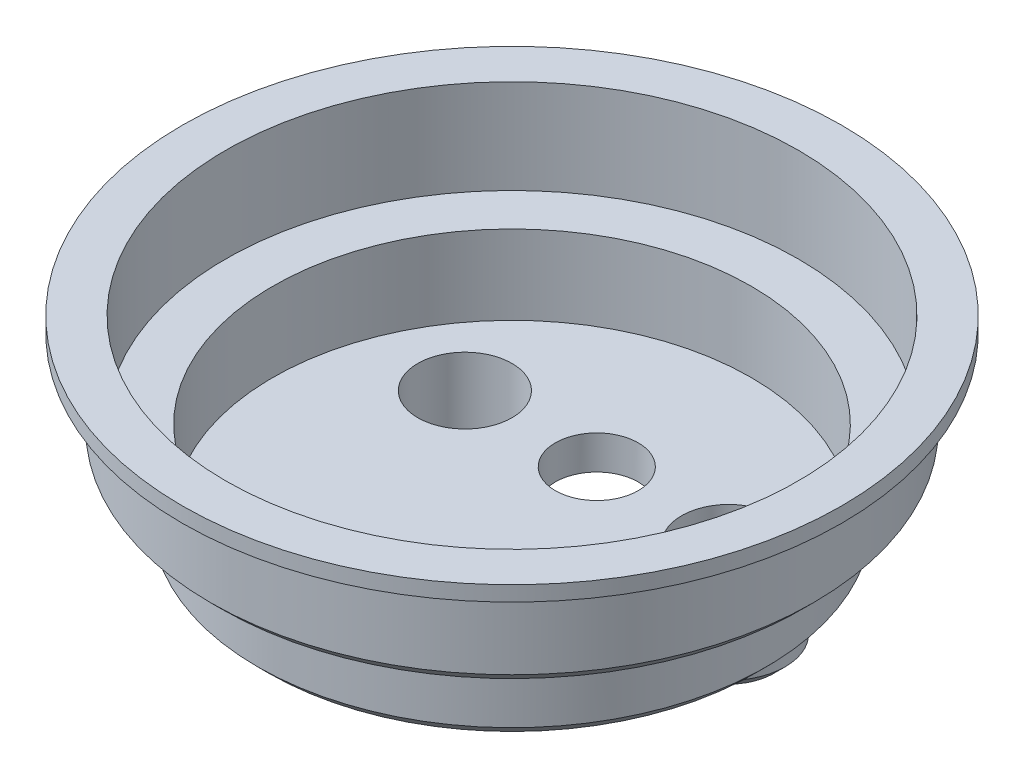
ISO-10303-21;
HEADER;
FILE_DESCRIPTION(('STEP AP214'),'2;1');
FILE_NAME('part.step','',(''),(''),'','','');
FILE_SCHEMA(('AUTOMOTIVE_DESIGN { 1 0 10303 214 1 1 1 1 }'));
ENDSEC;
DATA;
#1=APPLICATION_CONTEXT('core data for automotive mechanical design processes');
#2=APPLICATION_PROTOCOL_DEFINITION('international standard','automotive_design',2000,#1);
#3=PRODUCT_CONTEXT('',#1,'mechanical');
#4=PRODUCT('Part','Part','',(#3));
#5=PRODUCT_RELATED_PRODUCT_CATEGORY('part','',(#4));
#6=PRODUCT_DEFINITION_FORMATION('','',#4);
#7=PRODUCT_DEFINITION_CONTEXT('part definition',#1,'design');
#8=PRODUCT_DEFINITION('design','',#6,#7);
#9=PRODUCT_DEFINITION_SHAPE('','',#8);
#10=(LENGTH_UNIT() NAMED_UNIT(*) SI_UNIT(.MILLI.,.METRE.));
#11=(NAMED_UNIT(*) PLANE_ANGLE_UNIT() SI_UNIT($,.RADIAN.));
#12=(NAMED_UNIT(*) SI_UNIT($,.STERADIAN.) SOLID_ANGLE_UNIT());
#13=UNCERTAINTY_MEASURE_WITH_UNIT(LENGTH_MEASURE(1.E-05),#10,'distance_accuracy_value','');
#14=(GEOMETRIC_REPRESENTATION_CONTEXT(3) GLOBAL_UNCERTAINTY_ASSIGNED_CONTEXT((#13)) GLOBAL_UNIT_ASSIGNED_CONTEXT((#10,
#11,#12)) REPRESENTATION_CONTEXT('',''));
#15=CARTESIAN_POINT('',(0.,0.,0.));
#16=DIRECTION('',(0.,0.,1.));
#17=DIRECTION('',(1.,0.,0.));
#18=AXIS2_PLACEMENT_3D('',#15,#16,#17);
#19=CARTESIAN_POINT('',(0.,0.,0.));
#20=DIRECTION('',(0.,1.,0.));
#21=DIRECTION('',(0.,0.,1.));
#22=AXIS2_PLACEMENT_3D('',#19,#20,#21);
#23=PLANE('',#22);
#24=CARTESIAN_POINT('',(-35.,0.,-22.5));
#25=DIRECTION('',(0.,1.,0.));
#26=DIRECTION('',(0.,0.,1.));
#27=AXIS2_PLACEMENT_3D('',#24,#25,#26);
#28=CIRCLE('',#27,15.);
#29=CARTESIAN_POINT('',(-35.,0.,-7.5));
#30=VERTEX_POINT('',#29);
#31=EDGE_CURVE('E65',#30,#30,#28,.F.);
#32=ORIENTED_EDGE('',*,*,#31,.F.);
#33=EDGE_LOOP('',(#32));
#34=FACE_BOUND('',#33,.T.);
#35=CARTESIAN_POINT('',(35.,0.,-22.5));
#36=DIRECTION('',(0.,1.,0.));
#37=DIRECTION('',(0.,0.,1.));
#38=AXIS2_PLACEMENT_3D('',#35,#36,#37);
#39=CIRCLE('',#38,15.);
#40=CARTESIAN_POINT('',(35.,0.,-7.5));
#41=VERTEX_POINT('',#40);
#42=EDGE_CURVE('E78',#41,#41,#39,.F.);
#43=ORIENTED_EDGE('',*,*,#42,.F.);
#44=EDGE_LOOP('',(#43));
#45=FACE_BOUND('',#44,.T.);
#46=CARTESIAN_POINT('',(0.,0.,0.));
#47=DIRECTION('',(0.,1.,0.));
#48=DIRECTION('',(0.,0.,1.));
#49=AXIS2_PLACEMENT_3D('',#46,#47,#48);
#50=CIRCLE('',#49,64.4999999999999);
#51=CARTESIAN_POINT('',(0.,0.,64.4999999999999));
#52=VERTEX_POINT('',#51);
#53=EDGE_CURVE('E59',#52,#52,#50,.F.);
#54=ORIENTED_EDGE('',*,*,#53,.T.);
#55=EDGE_LOOP('',(#54));
#56=FACE_BOUND('',#55,.T.);
#57=CARTESIAN_POINT('',(0.,0.,-22.5));
#58=DIRECTION('',(0.,1.,0.));
#59=DIRECTION('',(0.,0.,1.));
#60=AXIS2_PLACEMENT_3D('',#57,#58,#59);
#61=CIRCLE('',#60,15.);
#62=CARTESIAN_POINT('',(0.,0.,-7.5));
#63=VERTEX_POINT('',#62);
#64=EDGE_CURVE('E10',#63,#63,#61,.F.);
#65=ORIENTED_EDGE('',*,*,#64,.F.);
#66=EDGE_LOOP('',(#65));
#67=FACE_BOUND('',#66,.T.);
#68=ADVANCED_FACE('F30',(#34,#45,#56,#67),#23,.F.);
#69=CARTESIAN_POINT('',(35.,-6.,-22.5));
#70=DIRECTION('',(0.,1.,0.));
#71=DIRECTION('',(0.,0.,1.));
#72=AXIS2_PLACEMENT_3D('',#69,#70,#71);
#73=CYLINDRICAL_SURFACE('',#72,6.25000000000001);
#74=CARTESIAN_POINT('',(35.,-20.,-22.5));
#75=DIRECTION('',(0.,-1.,0.));
#76=DIRECTION('',(0.,0.,-1.));
#77=AXIS2_PLACEMENT_3D('',#74,#75,#76);
#78=CIRCLE('',#77,6.25000000000001);
#79=CARTESIAN_POINT('',(35.,-20.,-28.75));
#80=VERTEX_POINT('',#79);
#81=EDGE_CURVE('E108',#80,#80,#78,.T.);
#82=ORIENTED_EDGE('',*,*,#81,.T.);
#83=EDGE_LOOP('',(#82));
#84=FACE_BOUND('',#83,.T.);
#85=CARTESIAN_POINT('',(35.,-16.,-22.5));
#86=DIRECTION('',(0.,1.,0.));
#87=DIRECTION('',(0.,0.,1.));
#88=AXIS2_PLACEMENT_3D('',#85,#86,#87);
#89=CIRCLE('',#88,6.25000000000001);
#90=CARTESIAN_POINT('',(35.,-16.,-16.25));
#91=VERTEX_POINT('',#90);
#92=EDGE_CURVE('E66',#91,#91,#89,.F.);
#93=ORIENTED_EDGE('',*,*,#92,.F.);
#94=EDGE_LOOP('',(#93));
#95=FACE_BOUND('',#94,.T.);
#96=ADVANCED_FACE('F145',(#84,#95),#73,.F.);
#97=CARTESIAN_POINT('',(-35.,-6.,-22.5));
#98=DIRECTION('',(0.,1.,0.));
#99=DIRECTION('',(0.,0.,1.));
#100=AXIS2_PLACEMENT_3D('',#97,#98,#99);
#101=CYLINDRICAL_SURFACE('',#100,6.25);
#102=CARTESIAN_POINT('',(-35.,-20.,-22.5));
#103=DIRECTION('',(0.,-1.,0.));
#104=DIRECTION('',(0.,0.,-1.));
#105=AXIS2_PLACEMENT_3D('',#102,#103,#104);
#106=CIRCLE('',#105,6.25);
#107=CARTESIAN_POINT('',(-35.,-20.,-28.75));
#108=VERTEX_POINT('',#107);
#109=EDGE_CURVE('E74',#108,#108,#106,.T.);
#110=ORIENTED_EDGE('',*,*,#109,.T.);
#111=EDGE_LOOP('',(#110));
#112=FACE_BOUND('',#111,.T.);
#113=CARTESIAN_POINT('',(-35.,-16.,-22.5));
#114=DIRECTION('',(0.,1.,0.));
#115=DIRECTION('',(0.,0.,1.));
#116=AXIS2_PLACEMENT_3D('',#113,#114,#115);
#117=CIRCLE('',#116,6.25);
#118=CARTESIAN_POINT('',(-35.,-16.,-16.25));
#119=VERTEX_POINT('',#118);
#120=EDGE_CURVE('E71',#119,#119,#117,.F.);
#121=ORIENTED_EDGE('',*,*,#120,.F.);
#122=EDGE_LOOP('',(#121));
#123=FACE_BOUND('',#122,.T.);
#124=ADVANCED_FACE('F151',(#112,#123),#101,.F.);
#125=CARTESIAN_POINT('',(0.,21.,0.));
#126=DIRECTION('',(0.,-1.,0.));
#127=DIRECTION('',(0.,0.,-1.));
#128=AXIS2_PLACEMENT_3D('',#125,#126,#127);
#129=CYLINDRICAL_SURFACE('',#128,67.5);
#130=CARTESIAN_POINT('',(0.,3.00000000000009,0.));
#131=DIRECTION('',(0.,1.,0.));
#132=DIRECTION('',(0.,0.,1.));
#133=AXIS2_PLACEMENT_3D('',#130,#131,#132);
#134=CIRCLE('',#133,67.5);
#135=CARTESIAN_POINT('',(0.,3.00000000000009,-67.5));
#136=VERTEX_POINT('',#135);
#137=EDGE_CURVE('E62',#136,#136,#134,.T.);
#138=CARTESIAN_POINT('',(0.,21.,0.));
#139=DIRECTION('',(0.,1.,0.));
#140=DIRECTION('',(0.,0.,1.));
#141=AXIS2_PLACEMENT_3D('',#138,#139,#140);
#142=CIRCLE('',#141,67.5);
#143=CARTESIAN_POINT('',(0.,21.,-67.5));
#144=VERTEX_POINT('',#143);
#145=EDGE_CURVE('E81',#144,#144,#142,.T.);
#146=CARTESIAN_POINT('',(0.,3.00000000000009,-67.5));
#147=CARTESIAN_POINT('',(0.,3.18750000000008,-67.5));
#148=CARTESIAN_POINT('',(0.,3.37500000000008,-67.5));
#149=CARTESIAN_POINT('',(0.,3.75000000000008,-67.5));
#150=CARTESIAN_POINT('',(0.,3.93750000000008,-67.5));
#151=CARTESIAN_POINT('',(0.,4.31250000000008,-67.5));
#152=CARTESIAN_POINT('',(0.,4.50000000000008,-67.5));
#153=CARTESIAN_POINT('',(0.,4.87500000000008,-67.5));
#154=CARTESIAN_POINT('',(0.,5.06250000000007,-67.5));
#155=CARTESIAN_POINT('',(0.,5.43750000000007,-67.5));
#156=CARTESIAN_POINT('',(0.,5.62500000000007,-67.5));
#157=CARTESIAN_POINT('',(0.,6.00000000000007,-67.5));
#158=CARTESIAN_POINT('',(0.,6.18750000000007,-67.5));
#159=CARTESIAN_POINT('',(0.,6.56250000000007,-67.5));
#160=CARTESIAN_POINT('',(0.,6.75000000000007,-67.5));
#161=CARTESIAN_POINT('',(0.,7.12500000000007,-67.5));
#162=CARTESIAN_POINT('',(0.,7.31250000000006,-67.5));
#163=CARTESIAN_POINT('',(0.,7.68750000000006,-67.5));
#164=CARTESIAN_POINT('',(0.,7.87500000000006,-67.5));
#165=CARTESIAN_POINT('',(0.,8.25000000000006,-67.5));
#166=CARTESIAN_POINT('',(0.,8.43750000000006,-67.5));
#167=CARTESIAN_POINT('',(0.,8.81250000000006,-67.5));
#168=CARTESIAN_POINT('',(0.,9.00000000000006,-67.5));
#169=CARTESIAN_POINT('',(0.,9.37500000000006,-67.5));
#170=CARTESIAN_POINT('',(0.,9.56250000000006,-67.5));
#171=CARTESIAN_POINT('',(0.,9.93750000000005,-67.5));
#172=CARTESIAN_POINT('',(0.,10.1250000000001,-67.5));
#173=CARTESIAN_POINT('',(0.,10.5000000000001,-67.5));
#174=CARTESIAN_POINT('',(0.,10.6875,-67.5));
#175=CARTESIAN_POINT('',(0.,11.0625,-67.5));
#176=CARTESIAN_POINT('',(0.,11.25,-67.5));
#177=CARTESIAN_POINT('',(0.,11.625,-67.5));
#178=CARTESIAN_POINT('',(0.,11.8125,-67.5));
#179=CARTESIAN_POINT('',(0.,12.1875,-67.5));
#180=CARTESIAN_POINT('',(0.,12.375,-67.5));
#181=CARTESIAN_POINT('',(0.,12.75,-67.5));
#182=CARTESIAN_POINT('',(0.,12.9375,-67.5));
#183=CARTESIAN_POINT('',(0.,13.3125,-67.5));
#184=CARTESIAN_POINT('',(0.,13.5,-67.5));
#185=CARTESIAN_POINT('',(0.,13.875,-67.5));
#186=CARTESIAN_POINT('',(0.,14.0625,-67.5));
#187=CARTESIAN_POINT('',(0.,14.4375,-67.5));
#188=CARTESIAN_POINT('',(0.,14.625,-67.5));
#189=CARTESIAN_POINT('',(0.,15.,-67.5));
#190=CARTESIAN_POINT('',(0.,15.1875,-67.5));
#191=CARTESIAN_POINT('',(0.,15.5625,-67.5));
#192=CARTESIAN_POINT('',(0.,15.75,-67.5));
#193=CARTESIAN_POINT('',(0.,16.125,-67.5));
#194=CARTESIAN_POINT('',(0.,16.3125,-67.5));
#195=CARTESIAN_POINT('',(0.,16.6875,-67.5));
#196=CARTESIAN_POINT('',(0.,16.875,-67.5));
#197=CARTESIAN_POINT('',(0.,17.25,-67.5));
#198=CARTESIAN_POINT('',(0.,17.4375,-67.5));
#199=CARTESIAN_POINT('',(0.,17.8125,-67.5));
#200=CARTESIAN_POINT('',(0.,18.,-67.5));
#201=CARTESIAN_POINT('',(0.,18.375,-67.5));
#202=CARTESIAN_POINT('',(0.,18.5625,-67.5));
#203=CARTESIAN_POINT('',(0.,18.9375,-67.5));
#204=CARTESIAN_POINT('',(0.,19.125,-67.5));
#205=CARTESIAN_POINT('',(0.,19.5,-67.5));
#206=CARTESIAN_POINT('',(0.,19.6875,-67.5));
#207=CARTESIAN_POINT('',(0.,20.0625,-67.5));
#208=CARTESIAN_POINT('',(0.,20.25,-67.5));
#209=CARTESIAN_POINT('',(0.,20.625,-67.5));
#210=CARTESIAN_POINT('',(0.,20.8125,-67.5));
#211=CARTESIAN_POINT('',(0.,21.,-67.5));
#212=B_SPLINE_CURVE_WITH_KNOTS('',3,(#146,#147,#148,#149,#150,#151,#152,#153,#154,#155,#156,
#157,#158,#159,#160,#161,#162,#163,#164,#165,#166,#167,#168,#169,#170,#171,#172,#173,#174,#175,
#176,#177,#178,#179,#180,#181,#182,#183,#184,#185,#186,#187,#188,#189,#190,#191,#192,#193,#194,
#195,#196,#197,#198,#199,#200,#201,#202,#203,#204,#205,#206,#207,#208,#209,#210,#211),
.UNSPECIFIED.,.F.,.F.,(4,2,2,2,2,2,2,2,2,2,2,2,2,2,2,2,2,2,2,2,2,2,2,2,2,2,2,2,2,2,2,2,4),(0.,
0.562499999999997,1.12499999999999,1.68749999999999,2.24999999999999,2.81249999999999,
3.37499999999998,3.93749999999998,4.49999999999998,5.06249999999998,5.62499999999997,
6.18749999999997,6.74999999999997,7.31249999999996,7.87499999999996,8.43749999999996,
8.99999999999996,9.56249999999996,10.125,10.6875,11.2499999999999,11.8124999999999,
12.3749999999999,12.9374999999999,13.4999999999999,14.0624999999999,14.6249999999999,
15.1874999999999,15.7499999999999,16.3124999999999,16.8749999999999,17.4374999999999,
17.9999999999999),.UNSPECIFIED.);
#213=EDGE_CURVE('BSEAM160',#136,#144,#212,.T.);
#214=ORIENTED_EDGE('',*,*,#137,.T.);
#215=ORIENTED_EDGE('',*,*,#145,.F.);
#216=ORIENTED_EDGE('',*,*,#213,.T.);
#217=ORIENTED_EDGE('',*,*,#213,.F.);
#218=EDGE_LOOP('',(#214,#216,#215,#217));
#219=FACE_BOUND('',#218,.T.);
#220=ADVANCED_FACE('F160',(#219),#129,.T.);
#221=CARTESIAN_POINT('',(0.,21.,0.));
#222=DIRECTION('',(0.,1.,0.));
#223=DIRECTION('',(0.,0.,1.));
#224=AXIS2_PLACEMENT_3D('',#221,#222,#223);
#225=PLANE('',#224);
#226=CARTESIAN_POINT('',(0.,21.,0.));
#227=DIRECTION('',(0.,1.,0.));
#228=DIRECTION('',(0.,0.,1.));
#229=AXIS2_PLACEMENT_3D('',#226,#227,#228);
#230=CIRCLE('',#229,77.);
#231=CARTESIAN_POINT('',(0.,21.,77.));
#232=VERTEX_POINT('',#231);
#233=EDGE_CURVE('E53',#232,#232,#230,.F.);
#234=ORIENTED_EDGE('',*,*,#233,.T.);
#235=EDGE_LOOP('',(#234));
#236=FACE_BOUND('',#235,.T.);
#237=ORIENTED_EDGE('',*,*,#145,.T.);
#238=EDGE_LOOP('',(#237));
#239=FACE_BOUND('',#238,.T.);
#240=ADVANCED_FACE('F163',(#236,#239),#225,.F.);
#241=CARTESIAN_POINT('',(0.,46.,0.));
#242=DIRECTION('',(0.,-1.,0.));
#243=DIRECTION('',(0.,0.,-1.));
#244=AXIS2_PLACEMENT_3D('',#241,#242,#243);
#245=CYLINDRICAL_SURFACE('',#244,80.);
#246=CARTESIAN_POINT('',(0.,24.,0.));
#247=DIRECTION('',(0.,1.,0.));
#248=DIRECTION('',(0.,0.,1.));
#249=AXIS2_PLACEMENT_3D('',#246,#247,#248);
#250=CIRCLE('',#249,80.);
#251=CARTESIAN_POINT('',(0.,24.,80.));
#252=VERTEX_POINT('',#251);
#253=EDGE_CURVE('E56',#252,#252,#250,.T.);
#254=ORIENTED_EDGE('',*,*,#253,.T.);
#255=EDGE_LOOP('',(#254));
#256=FACE_BOUND('',#255,.T.);
#257=CARTESIAN_POINT('',(0.,46.,0.));
#258=DIRECTION('',(0.,1.,0.));
#259=DIRECTION('',(0.,0.,1.));
#260=AXIS2_PLACEMENT_3D('',#257,#258,#259);
#261=CIRCLE('',#260,80.);
#262=CARTESIAN_POINT('',(0.,46.,80.));
#263=VERTEX_POINT('',#262);
#264=EDGE_CURVE('E84',#263,#263,#261,.T.);
#265=ORIENTED_EDGE('',*,*,#264,.F.);
#266=EDGE_LOOP('',(#265));
#267=FACE_BOUND('',#266,.T.);
#268=ADVANCED_FACE('F158',(#256,#267),#245,.T.);
#269=CARTESIAN_POINT('',(0.,46.,0.));
#270=DIRECTION('',(0.,1.,0.));
#271=DIRECTION('',(0.,0.,1.));
#272=AXIS2_PLACEMENT_3D('',#269,#270,#271);
#273=PLANE('',#272);
#274=CARTESIAN_POINT('',(0.,46.,0.));
#275=DIRECTION('',(0.,1.,0.));
#276=DIRECTION('',(0.,0.,1.));
#277=AXIS2_PLACEMENT_3D('',#274,#275,#276);
#278=CIRCLE('',#277,87.5);
#279=CARTESIAN_POINT('',(0.,46.,87.5));
#280=VERTEX_POINT('',#279);
#281=EDGE_CURVE('E88',#280,#280,#278,.T.);
#282=ORIENTED_EDGE('',*,*,#281,.F.);
#283=EDGE_LOOP('',(#282));
#284=FACE_BOUND('',#283,.T.);
#285=ORIENTED_EDGE('',*,*,#264,.T.);
#286=EDGE_LOOP('',(#285));
#287=FACE_BOUND('',#286,.T.);
#288=ADVANCED_FACE('F241',(#284,#287),#273,.F.);
#289=CARTESIAN_POINT('',(0.,50.,0.));
#290=DIRECTION('',(0.,-1.,0.));
#291=DIRECTION('',(0.,0.,-1.));
#292=AXIS2_PLACEMENT_3D('',#289,#290,#291);
#293=CYLINDRICAL_SURFACE('',#292,87.5);
#294=CARTESIAN_POINT('',(0.,50.,0.));
#295=DIRECTION('',(0.,1.,0.));
#296=DIRECTION('',(0.,0.,1.));
#297=AXIS2_PLACEMENT_3D('',#294,#295,#296);
#298=CIRCLE('',#297,87.5);
#299=CARTESIAN_POINT('',(0.,50.,87.5));
#300=VERTEX_POINT('',#299);
#301=EDGE_CURVE('E87',#300,#300,#298,.T.);
#302=ORIENTED_EDGE('',*,*,#301,.F.);
#303=EDGE_LOOP('',(#302));
#304=FACE_BOUND('',#303,.T.);
#305=ORIENTED_EDGE('',*,*,#281,.T.);
#306=EDGE_LOOP('',(#305));
#307=FACE_BOUND('',#306,.T.);
#308=ADVANCED_FACE('F239',(#304,#307),#293,.T.);
#309=CARTESIAN_POINT('',(0.,50.,0.));
#310=DIRECTION('',(0.,1.,0.));
#311=DIRECTION('',(0.,0.,1.));
#312=AXIS2_PLACEMENT_3D('',#309,#310,#311);
#313=PLANE('',#312);
#314=CARTESIAN_POINT('',(0.,50.,0.));
#315=DIRECTION('',(0.,1.,0.));
#316=DIRECTION('',(0.,0.,1.));
#317=AXIS2_PLACEMENT_3D('',#314,#315,#316);
#318=CIRCLE('',#317,76.);
#319=CARTESIAN_POINT('',(0.,50.,76.));
#320=VERTEX_POINT('',#319);
#321=EDGE_CURVE('E94',#320,#320,#318,.T.);
#322=ORIENTED_EDGE('',*,*,#321,.F.);
#323=EDGE_LOOP('',(#322));
#324=FACE_BOUND('',#323,.T.);
#325=ORIENTED_EDGE('',*,*,#301,.T.);
#326=EDGE_LOOP('',(#325));
#327=FACE_BOUND('',#326,.T.);
#328=ADVANCED_FACE('F225',(#324,#327),#313,.T.);
#329=CARTESIAN_POINT('',(0.,21.,0.));
#330=DIRECTION('',(0.,-1.,0.));
#331=DIRECTION('',(0.,0.,-1.));
#332=AXIS2_PLACEMENT_3D('',#329,#330,#331);
#333=CYLINDRICAL_SURFACE('',#332,63.5);
#334=CARTESIAN_POINT('',(0.,25.,0.));
#335=DIRECTION('',(0.,1.,0.));
#336=DIRECTION('',(0.,0.,1.));
#337=AXIS2_PLACEMENT_3D('',#334,#335,#336);
#338=CIRCLE('',#337,63.5);
#339=CARTESIAN_POINT('',(0.,25.,-63.5));
#340=VERTEX_POINT('',#339);
#341=EDGE_CURVE('E91',#340,#340,#338,.T.);
#342=CARTESIAN_POINT('',(0.,4.,0.));
#343=DIRECTION('',(0.,1.,0.));
#344=DIRECTION('',(0.,0.,1.));
#345=AXIS2_PLACEMENT_3D('',#342,#343,#344);
#346=CIRCLE('',#345,63.5);
#347=CARTESIAN_POINT('',(0.,4.,-63.5));
#348=VERTEX_POINT('',#347);
#349=EDGE_CURVE('E97',#348,#348,#346,.T.);
#350=CARTESIAN_POINT('',(0.,25.,-63.5));
#351=CARTESIAN_POINT('',(0.,24.78125,-63.5));
#352=CARTESIAN_POINT('',(0.,24.5625,-63.5));
#353=CARTESIAN_POINT('',(0.,24.125,-63.5));
#354=CARTESIAN_POINT('',(0.,23.90625,-63.5));
#355=CARTESIAN_POINT('',(0.,23.46875,-63.5));
#356=CARTESIAN_POINT('',(0.,23.25,-63.5));
#357=CARTESIAN_POINT('',(0.,22.8125,-63.5));
#358=CARTESIAN_POINT('',(0.,22.59375,-63.5));
#359=CARTESIAN_POINT('',(0.,22.15625,-63.5));
#360=CARTESIAN_POINT('',(0.,21.9375,-63.5));
#361=CARTESIAN_POINT('',(0.,21.5,-63.5));
#362=CARTESIAN_POINT('',(0.,21.28125,-63.5));
#363=CARTESIAN_POINT('',(0.,20.84375,-63.5));
#364=CARTESIAN_POINT('',(0.,20.625,-63.5));
#365=CARTESIAN_POINT('',(0.,20.1875,-63.5));
#366=CARTESIAN_POINT('',(0.,19.96875,-63.5));
#367=CARTESIAN_POINT('',(0.,19.53125,-63.5));
#368=CARTESIAN_POINT('',(0.,19.3125,-63.5));
#369=CARTESIAN_POINT('',(0.,18.875,-63.5));
#370=CARTESIAN_POINT('',(0.,18.65625,-63.5));
#371=CARTESIAN_POINT('',(0.,18.21875,-63.5));
#372=CARTESIAN_POINT('',(0.,18.,-63.5));
#373=CARTESIAN_POINT('',(0.,17.5625,-63.5));
#374=CARTESIAN_POINT('',(0.,17.34375,-63.5));
#375=CARTESIAN_POINT('',(0.,16.90625,-63.5));
#376=CARTESIAN_POINT('',(0.,16.6875,-63.5));
#377=CARTESIAN_POINT('',(0.,16.25,-63.5));
#378=CARTESIAN_POINT('',(0.,16.03125,-63.5));
#379=CARTESIAN_POINT('',(0.,15.59375,-63.5));
#380=CARTESIAN_POINT('',(0.,15.375,-63.5));
#381=CARTESIAN_POINT('',(0.,14.9375,-63.5));
#382=CARTESIAN_POINT('',(0.,14.71875,-63.5));
#383=CARTESIAN_POINT('',(0.,14.28125,-63.5));
#384=CARTESIAN_POINT('',(0.,14.0625,-63.5));
#385=CARTESIAN_POINT('',(0.,13.625,-63.5));
#386=CARTESIAN_POINT('',(0.,13.40625,-63.5));
#387=CARTESIAN_POINT('',(0.,12.96875,-63.5));
#388=CARTESIAN_POINT('',(0.,12.75,-63.5));
#389=CARTESIAN_POINT('',(0.,12.3125,-63.5));
#390=CARTESIAN_POINT('',(0.,12.09375,-63.5));
#391=CARTESIAN_POINT('',(0.,11.65625,-63.5));
#392=CARTESIAN_POINT('',(0.,11.4375,-63.5));
#393=CARTESIAN_POINT('',(0.,11.,-63.5));
#394=CARTESIAN_POINT('',(0.,10.78125,-63.5));
#395=CARTESIAN_POINT('',(0.,10.34375,-63.5));
#396=CARTESIAN_POINT('',(0.,10.125,-63.5));
#397=CARTESIAN_POINT('',(0.,9.6875,-63.5));
#398=CARTESIAN_POINT('',(0.,9.46875,-63.5));
#399=CARTESIAN_POINT('',(0.,9.03125,-63.5));
#400=CARTESIAN_POINT('',(0.,8.8125,-63.5));
#401=CARTESIAN_POINT('',(0.,8.375,-63.5));
#402=CARTESIAN_POINT('',(0.,8.15625,-63.5));
#403=CARTESIAN_POINT('',(0.,7.71875,-63.5));
#404=CARTESIAN_POINT('',(0.,7.5,-63.5));
#405=CARTESIAN_POINT('',(0.,7.0625,-63.5));
#406=CARTESIAN_POINT('',(0.,6.84375,-63.5));
#407=CARTESIAN_POINT('',(0.,6.40625,-63.5));
#408=CARTESIAN_POINT('',(0.,6.1875,-63.5));
#409=CARTESIAN_POINT('',(0.,5.75,-63.5));
#410=CARTESIAN_POINT('',(0.,5.53125,-63.5));
#411=CARTESIAN_POINT('',(0.,5.09375,-63.5));
#412=CARTESIAN_POINT('',(0.,4.875,-63.5));
#413=CARTESIAN_POINT('',(0.,4.4375,-63.5));
#414=CARTESIAN_POINT('',(0.,4.21875,-63.5));
#415=CARTESIAN_POINT('',(0.,4.,-63.5));
#416=B_SPLINE_CURVE_WITH_KNOTS('',3,(#350,#351,#352,#353,#354,#355,#356,#357,#358,#359,#360,
#361,#362,#363,#364,#365,#366,#367,#368,#369,#370,#371,#372,#373,#374,#375,#376,#377,#378,#379,
#380,#381,#382,#383,#384,#385,#386,#387,#388,#389,#390,#391,#392,#393,#394,#395,#396,#397,#398,
#399,#400,#401,#402,#403,#404,#405,#406,#407,#408,#409,#410,#411,#412,#413,#414,#415),
.UNSPECIFIED.,.F.,.F.,(4,2,2,2,2,2,2,2,2,2,2,2,2,2,2,2,2,2,2,2,2,2,2,2,2,2,2,2,2,2,2,2,4),(0.,
0.656250000000001,1.3125,1.96875,2.625,3.28125,3.9375,4.59375,5.25,5.90625,6.5625,7.21875,7.875,
8.53125,9.1875,9.84375,10.5,11.15625,11.8125,12.46875,13.125,13.78125,14.4375,15.09375,15.75,
16.40625,17.0625,17.71875,18.375,19.03125,19.6875,20.34375,21.),.UNSPECIFIED.);
#417=EDGE_CURVE('BSEAM221',#340,#348,#416,.T.);
#418=ORIENTED_EDGE('',*,*,#341,.T.);
#419=ORIENTED_EDGE('',*,*,#349,.F.);
#420=ORIENTED_EDGE('',*,*,#417,.T.);
#421=ORIENTED_EDGE('',*,*,#417,.F.);
#422=EDGE_LOOP('',(#418,#420,#419,#421));
#423=FACE_BOUND('',#422,.T.);
#424=ADVANCED_FACE('F221',(#423),#333,.F.);
#425=CARTESIAN_POINT('',(0.,4.,0.));
#426=DIRECTION('',(0.,1.,0.));
#427=DIRECTION('',(0.,0.,1.));
#428=AXIS2_PLACEMENT_3D('',#425,#426,#427);
#429=PLANE('',#428);
#430=CARTESIAN_POINT('',(35.,4.,-22.5));
#431=DIRECTION('',(0.,1.,0.));
#432=DIRECTION('',(0.,0.,1.));
#433=AXIS2_PLACEMENT_3D('',#430,#431,#432);
#434=CIRCLE('',#433,12.5);
#435=CARTESIAN_POINT('',(35.,4.,-10.));
#436=VERTEX_POINT('',#435);
#437=EDGE_CURVE('E117',#436,#436,#434,.T.);
#438=ORIENTED_EDGE('',*,*,#437,.F.);
#439=EDGE_LOOP('',(#438));
#440=FACE_BOUND('',#439,.T.);
#441=CARTESIAN_POINT('',(-35.,4.,-22.5));
#442=DIRECTION('',(0.,1.,0.));
#443=DIRECTION('',(0.,0.,1.));
#444=AXIS2_PLACEMENT_3D('',#441,#442,#443);
#445=CIRCLE('',#444,12.5);
#446=CARTESIAN_POINT('',(-35.,4.,-9.99999999999999));
#447=VERTEX_POINT('',#446);
#448=EDGE_CURVE('E69',#447,#447,#445,.T.);
#449=ORIENTED_EDGE('',*,*,#448,.F.);
#450=EDGE_LOOP('',(#449));
#451=FACE_BOUND('',#450,.T.);
#452=CARTESIAN_POINT('',(0.,4.,-22.5));
#453=DIRECTION('',(0.,1.,0.));
#454=DIRECTION('',(0.,0.,1.));
#455=AXIS2_PLACEMENT_3D('',#452,#453,#454);
#456=CIRCLE('',#455,11.);
#457=CARTESIAN_POINT('',(0.,4.,-11.5));
#458=VERTEX_POINT('',#457);
#459=EDGE_CURVE('E101',#458,#458,#456,.T.);
#460=ORIENTED_EDGE('',*,*,#459,.F.);
#461=EDGE_LOOP('',(#460));
#462=FACE_BOUND('',#461,.T.);
#463=ORIENTED_EDGE('',*,*,#349,.T.);
#464=EDGE_LOOP('',(#463));
#465=FACE_BOUND('',#464,.T.);
#466=ADVANCED_FACE('F224',(#440,#451,#462,#465),#429,.T.);
#467=CARTESIAN_POINT('',(0.,25.,0.));
#468=DIRECTION('',(0.,1.,0.));
#469=DIRECTION('',(0.,0.,1.));
#470=AXIS2_PLACEMENT_3D('',#467,#468,#469);
#471=PLANE('',#470);
#472=CARTESIAN_POINT('',(0.,25.,0.));
#473=DIRECTION('',(0.,1.,0.));
#474=DIRECTION('',(0.,0.,1.));
#475=AXIS2_PLACEMENT_3D('',#472,#473,#474);
#476=CIRCLE('',#475,76.);
#477=CARTESIAN_POINT('',(0.,25.,76.));
#478=VERTEX_POINT('',#477);
#479=EDGE_CURVE('E98',#478,#478,#476,.T.);
#480=ORIENTED_EDGE('',*,*,#479,.T.);
#481=EDGE_LOOP('',(#480));
#482=FACE_BOUND('',#481,.T.);
#483=ORIENTED_EDGE('',*,*,#341,.F.);
#484=EDGE_LOOP('',(#483));
#485=FACE_BOUND('',#484,.T.);
#486=ADVANCED_FACE('F229',(#482,#485),#471,.T.);
#487=CARTESIAN_POINT('',(0.,46.,0.));
#488=DIRECTION('',(0.,-1.,0.));
#489=DIRECTION('',(0.,0.,-1.));
#490=AXIS2_PLACEMENT_3D('',#487,#488,#489);
#491=CYLINDRICAL_SURFACE('',#490,76.);
#492=ORIENTED_EDGE('',*,*,#321,.T.);
#493=EDGE_LOOP('',(#492));
#494=FACE_BOUND('',#493,.T.);
#495=ORIENTED_EDGE('',*,*,#479,.F.);
#496=EDGE_LOOP('',(#495));
#497=FACE_BOUND('',#496,.T.);
#498=ADVANCED_FACE('F219',(#494,#497),#491,.F.);
#499=CARTESIAN_POINT('',(0.,-6.,-22.5));
#500=DIRECTION('',(0.,1.,0.));
#501=DIRECTION('',(0.,0.,1.));
#502=AXIS2_PLACEMENT_3D('',#499,#500,#501);
#503=CYLINDRICAL_SURFACE('',#502,11.);
#504=ORIENTED_EDGE('',*,*,#459,.T.);
#505=EDGE_LOOP('',(#504));
#506=FACE_BOUND('',#505,.T.);
#507=CARTESIAN_POINT('',(0.,-5.,-22.5));
#508=DIRECTION('',(0.,-1.,0.));
#509=DIRECTION('',(0.,0.,-1.));
#510=AXIS2_PLACEMENT_3D('',#507,#508,#509);
#511=CIRCLE('',#510,11.);
#512=CARTESIAN_POINT('',(0.,-5.,-33.5));
#513=VERTEX_POINT('',#512);
#514=EDGE_CURVE('E125',#513,#513,#511,.T.);
#515=ORIENTED_EDGE('',*,*,#514,.T.);
#516=EDGE_LOOP('',(#515));
#517=FACE_BOUND('',#516,.T.);
#518=ADVANCED_FACE('F129',(#506,#517),#503,.F.);
#519=CARTESIAN_POINT('',(35.,-20.,-22.5));
#520=DIRECTION('',(0.,-1.,0.));
#521=DIRECTION('',(0.,0.,-1.));
#522=AXIS2_PLACEMENT_3D('',#519,#520,#521);
#523=PLANE('',#522);
#524=CARTESIAN_POINT('',(35.,-20.,-22.5));
#525=DIRECTION('',(0.,-1.,0.));
#526=DIRECTION('',(0.,0.,-1.));
#527=AXIS2_PLACEMENT_3D('',#524,#525,#526);
#528=CIRCLE('',#527,12.0000000000001);
#529=CARTESIAN_POINT('',(35.,-20.,-34.5000000000001));
#530=VERTEX_POINT('',#529);
#531=EDGE_CURVE('E41',#530,#530,#528,.T.);
#532=ORIENTED_EDGE('',*,*,#531,.T.);
#533=EDGE_LOOP('',(#532));
#534=FACE_BOUND('',#533,.T.);
#535=ORIENTED_EDGE('',*,*,#81,.F.);
#536=EDGE_LOOP('',(#535));
#537=FACE_BOUND('',#536,.T.);
#538=ADVANCED_FACE('F211',(#534,#537),#523,.T.);
#539=CARTESIAN_POINT('',(35.,-20.,-22.5));
#540=DIRECTION('',(0.,1.,0.));
#541=DIRECTION('',(0.,0.,1.));
#542=AXIS2_PLACEMENT_3D('',#539,#540,#541);
#543=CYLINDRICAL_SURFACE('',#542,15.);
#544=CARTESIAN_POINT('',(35.,-17.,-22.5));
#545=DIRECTION('',(0.,-1.,0.));
#546=DIRECTION('',(0.,0.,-1.));
#547=AXIS2_PLACEMENT_3D('',#544,#545,#546);
#548=CIRCLE('',#547,15.);
#549=CARTESIAN_POINT('',(35.,-17.,-37.5));
#550=VERTEX_POINT('',#549);
#551=EDGE_CURVE('E37',#550,#550,#548,.F.);
#552=ORIENTED_EDGE('',*,*,#551,.T.);
#553=EDGE_LOOP('',(#552));
#554=FACE_BOUND('',#553,.T.);
#555=ORIENTED_EDGE('',*,*,#42,.T.);
#556=EDGE_LOOP('',(#555));
#557=FACE_BOUND('',#556,.T.);
#558=ADVANCED_FACE('F185',(#554,#557),#543,.T.);
#559=CARTESIAN_POINT('',(-35.,-20.,-22.5));
#560=DIRECTION('',(0.,-1.,0.));
#561=DIRECTION('',(0.,0.,-1.));
#562=AXIS2_PLACEMENT_3D('',#559,#560,#561);
#563=PLANE('',#562);
#564=CARTESIAN_POINT('',(-35.,-20.,-22.5));
#565=DIRECTION('',(0.,-1.,0.));
#566=DIRECTION('',(0.,0.,-1.));
#567=AXIS2_PLACEMENT_3D('',#564,#565,#566);
#568=CIRCLE('',#567,12.0000000000001);
#569=CARTESIAN_POINT('',(-35.,-20.,-34.5000000000001));
#570=VERTEX_POINT('',#569);
#571=EDGE_CURVE('E50',#570,#570,#568,.T.);
#572=ORIENTED_EDGE('',*,*,#571,.T.);
#573=EDGE_LOOP('',(#572));
#574=FACE_BOUND('',#573,.T.);
#575=ORIENTED_EDGE('',*,*,#109,.F.);
#576=EDGE_LOOP('',(#575));
#577=FACE_BOUND('',#576,.T.);
#578=ADVANCED_FACE('F181',(#574,#577),#563,.T.);
#579=CARTESIAN_POINT('',(-35.,-20.,-22.5));
#580=DIRECTION('',(0.,1.,0.));
#581=DIRECTION('',(0.,0.,1.));
#582=AXIS2_PLACEMENT_3D('',#579,#580,#581);
#583=CYLINDRICAL_SURFACE('',#582,15.);
#584=CARTESIAN_POINT('',(-35.,-17.,-22.5));
#585=DIRECTION('',(0.,-1.,0.));
#586=DIRECTION('',(0.,0.,-1.));
#587=AXIS2_PLACEMENT_3D('',#584,#585,#586);
#588=CIRCLE('',#587,15.);
#589=CARTESIAN_POINT('',(-35.,-17.,-37.5));
#590=VERTEX_POINT('',#589);
#591=EDGE_CURVE('E45',#590,#590,#588,.F.);
#592=ORIENTED_EDGE('',*,*,#591,.T.);
#593=EDGE_LOOP('',(#592));
#594=FACE_BOUND('',#593,.T.);
#595=ORIENTED_EDGE('',*,*,#31,.T.);
#596=EDGE_LOOP('',(#595));
#597=FACE_BOUND('',#596,.T.);
#598=ADVANCED_FACE('F184',(#594,#597),#583,.T.);
#599=CARTESIAN_POINT('',(-35.,-16.,-22.5));
#600=DIRECTION('',(0.,1.,0.));
#601=DIRECTION('',(0.,0.,1.));
#602=AXIS2_PLACEMENT_3D('',#599,#600,#601);
#603=PLANE('',#602);
#604=CARTESIAN_POINT('',(-35.,-16.,-22.5));
#605=DIRECTION('',(0.,1.,0.));
#606=DIRECTION('',(0.,0.,1.));
#607=AXIS2_PLACEMENT_3D('',#604,#605,#606);
#608=CIRCLE('',#607,12.5);
#609=CARTESIAN_POINT('',(-35.,-16.,-9.99999999999999));
#610=VERTEX_POINT('',#609);
#611=EDGE_CURVE('E75',#610,#610,#608,.T.);
#612=ORIENTED_EDGE('',*,*,#611,.T.);
#613=EDGE_LOOP('',(#612));
#614=FACE_BOUND('',#613,.T.);
#615=ORIENTED_EDGE('',*,*,#120,.T.);
#616=EDGE_LOOP('',(#615));
#617=FACE_BOUND('',#616,.T.);
#618=ADVANCED_FACE('F194',(#614,#617),#603,.T.);
#619=CARTESIAN_POINT('',(-35.,-16.,-22.5));
#620=DIRECTION('',(0.,1.,0.));
#621=DIRECTION('',(0.,0.,1.));
#622=AXIS2_PLACEMENT_3D('',#619,#620,#621);
#623=CYLINDRICAL_SURFACE('',#622,12.5);
#624=ORIENTED_EDGE('',*,*,#611,.F.);
#625=EDGE_LOOP('',(#624));
#626=FACE_BOUND('',#625,.T.);
#627=ORIENTED_EDGE('',*,*,#448,.T.);
#628=EDGE_LOOP('',(#627));
#629=FACE_BOUND('',#628,.T.);
#630=ADVANCED_FACE('F196',(#626,#629),#623,.F.);
#631=CARTESIAN_POINT('',(35.,-16.,-22.5));
#632=DIRECTION('',(0.,1.,0.));
#633=DIRECTION('',(0.,0.,1.));
#634=AXIS2_PLACEMENT_3D('',#631,#632,#633);
#635=PLANE('',#634);
#636=CARTESIAN_POINT('',(35.,-16.,-22.5));
#637=DIRECTION('',(0.,1.,0.));
#638=DIRECTION('',(0.,0.,1.));
#639=AXIS2_PLACEMENT_3D('',#636,#637,#638);
#640=CIRCLE('',#639,12.5);
#641=CARTESIAN_POINT('',(35.,-16.,-10.));
#642=VERTEX_POINT('',#641);
#643=EDGE_CURVE('E70',#642,#642,#640,.T.);
#644=ORIENTED_EDGE('',*,*,#643,.T.);
#645=EDGE_LOOP('',(#644));
#646=FACE_BOUND('',#645,.T.);
#647=ORIENTED_EDGE('',*,*,#92,.T.);
#648=EDGE_LOOP('',(#647));
#649=FACE_BOUND('',#648,.T.);
#650=ADVANCED_FACE('F203',(#646,#649),#635,.T.);
#651=CARTESIAN_POINT('',(35.,-16.,-22.5));
#652=DIRECTION('',(0.,1.,0.));
#653=DIRECTION('',(0.,0.,1.));
#654=AXIS2_PLACEMENT_3D('',#651,#652,#653);
#655=CYLINDRICAL_SURFACE('',#654,12.5);
#656=ORIENTED_EDGE('',*,*,#643,.F.);
#657=EDGE_LOOP('',(#656));
#658=FACE_BOUND('',#657,.T.);
#659=ORIENTED_EDGE('',*,*,#437,.T.);
#660=EDGE_LOOP('',(#659));
#661=FACE_BOUND('',#660,.T.);
#662=ADVANCED_FACE('F169',(#658,#661),#655,.F.);
#663=CARTESIAN_POINT('',(0.,3.00000000000009,0.));
#664=DIRECTION('',(0.,1.,0.));
#665=DIRECTION('',(0.,0.,1.));
#666=AXIS2_PLACEMENT_3D('',#663,#664,#665);
#667=CONICAL_SURFACE('',#666,67.5,0.785398163397453);
#668=ORIENTED_EDGE('',*,*,#53,.F.);
#669=EDGE_LOOP('',(#668));
#670=FACE_BOUND('',#669,.T.);
#671=ORIENTED_EDGE('',*,*,#137,.F.);
#672=EDGE_LOOP('',(#671));
#673=FACE_BOUND('',#672,.T.);
#674=ADVANCED_FACE('F165',(#670,#673),#667,.T.);
#675=CARTESIAN_POINT('',(0.,24.,0.));
#676=DIRECTION('',(0.,1.,0.));
#677=DIRECTION('',(0.,0.,1.));
#678=AXIS2_PLACEMENT_3D('',#675,#676,#677);
#679=CONICAL_SURFACE('',#678,80.,0.785398163397453);
#680=CARTESIAN_POINT('',(0.,21.,77.));
#681=CARTESIAN_POINT('',(0.,21.03125,77.03125));
#682=CARTESIAN_POINT('',(0.,21.0625,77.0625));
#683=CARTESIAN_POINT('',(0.,21.125,77.125));
#684=CARTESIAN_POINT('',(0.,21.15625,77.15625));
#685=CARTESIAN_POINT('',(0.,21.21875,77.21875));
#686=CARTESIAN_POINT('',(0.,21.25,77.25));
#687=CARTESIAN_POINT('',(0.,21.3125,77.3125));
#688=CARTESIAN_POINT('',(0.,21.34375,77.34375));
#689=CARTESIAN_POINT('',(0.,21.40625,77.40625));
#690=CARTESIAN_POINT('',(0.,21.4375,77.4375));
#691=CARTESIAN_POINT('',(0.,21.5,77.5));
#692=CARTESIAN_POINT('',(0.,21.53125,77.53125));
#693=CARTESIAN_POINT('',(0.,21.59375,77.59375));
#694=CARTESIAN_POINT('',(0.,21.625,77.625));
#695=CARTESIAN_POINT('',(0.,21.6875,77.6875));
#696=CARTESIAN_POINT('',(0.,21.71875,77.71875));
#697=CARTESIAN_POINT('',(0.,21.78125,77.78125));
#698=CARTESIAN_POINT('',(0.,21.8125,77.8125));
#699=CARTESIAN_POINT('',(0.,21.875,77.875));
#700=CARTESIAN_POINT('',(0.,21.90625,77.90625));
#701=CARTESIAN_POINT('',(0.,21.96875,77.96875));
#702=CARTESIAN_POINT('',(0.,22.,78.));
#703=CARTESIAN_POINT('',(0.,22.0625,78.0625));
#704=CARTESIAN_POINT('',(0.,22.09375,78.09375));
#705=CARTESIAN_POINT('',(0.,22.15625,78.15625));
#706=CARTESIAN_POINT('',(0.,22.1875,78.1875));
#707=CARTESIAN_POINT('',(0.,22.25,78.25));
#708=CARTESIAN_POINT('',(0.,22.28125,78.28125));
#709=CARTESIAN_POINT('',(0.,22.34375,78.34375));
#710=CARTESIAN_POINT('',(0.,22.375,78.375));
#711=CARTESIAN_POINT('',(0.,22.4375,78.4375));
#712=CARTESIAN_POINT('',(0.,22.46875,78.46875));
#713=CARTESIAN_POINT('',(0.,22.53125,78.53125));
#714=CARTESIAN_POINT('',(0.,22.5625,78.5625));
#715=CARTESIAN_POINT('',(0.,22.625,78.625));
#716=CARTESIAN_POINT('',(0.,22.65625,78.65625));
#717=CARTESIAN_POINT('',(0.,22.71875,78.71875));
#718=CARTESIAN_POINT('',(0.,22.75,78.75));
#719=CARTESIAN_POINT('',(0.,22.8125,78.8125));
#720=CARTESIAN_POINT('',(0.,22.84375,78.84375));
#721=CARTESIAN_POINT('',(0.,22.90625,78.90625));
#722=CARTESIAN_POINT('',(0.,22.9375,78.9375));
#723=CARTESIAN_POINT('',(0.,23.,79.));
#724=CARTESIAN_POINT('',(0.,23.03125,79.03125));
#725=CARTESIAN_POINT('',(0.,23.09375,79.09375));
#726=CARTESIAN_POINT('',(0.,23.125,79.125));
#727=CARTESIAN_POINT('',(0.,23.1875,79.1875));
#728=CARTESIAN_POINT('',(0.,23.21875,79.21875));
#729=CARTESIAN_POINT('',(0.,23.28125,79.28125));
#730=CARTESIAN_POINT('',(0.,23.3125,79.3125));
#731=CARTESIAN_POINT('',(0.,23.375,79.375));
#732=CARTESIAN_POINT('',(0.,23.40625,79.40625));
#733=CARTESIAN_POINT('',(0.,23.46875,79.46875));
#734=CARTESIAN_POINT('',(0.,23.5,79.5));
#735=CARTESIAN_POINT('',(0.,23.5625,79.5625));
#736=CARTESIAN_POINT('',(0.,23.59375,79.59375));
#737=CARTESIAN_POINT('',(0.,23.65625,79.65625));
#738=CARTESIAN_POINT('',(0.,23.6875,79.6875));
#739=CARTESIAN_POINT('',(0.,23.75,79.75));
#740=CARTESIAN_POINT('',(0.,23.78125,79.78125));
#741=CARTESIAN_POINT('',(0.,23.84375,79.84375));
#742=CARTESIAN_POINT('',(0.,23.875,79.875));
#743=CARTESIAN_POINT('',(0.,23.9375,79.9375));
#744=CARTESIAN_POINT('',(0.,23.96875,79.96875));
#745=CARTESIAN_POINT('',(0.,24.,80.));
#746=B_SPLINE_CURVE_WITH_KNOTS('',3,(#680,#681,#682,#683,#684,#685,#686,#687,#688,#689,#690,
#691,#692,#693,#694,#695,#696,#697,#698,#699,#700,#701,#702,#703,#704,#705,#706,#707,#708,#709,
#710,#711,#712,#713,#714,#715,#716,#717,#718,#719,#720,#721,#722,#723,#724,#725,#726,#727,#728,
#729,#730,#731,#732,#733,#734,#735,#736,#737,#738,#739,#740,#741,#742,#743,#744,#745),
.UNSPECIFIED.,.F.,.F.,(4,2,2,2,2,2,2,2,2,2,2,2,2,2,2,2,2,2,2,2,2,2,2,2,2,2,2,2,2,2,2,2,4),(0.,
0.132582521472478,0.265165042944948,0.397747564417428,0.530330085889909,0.662912607362386,
0.795495128834857,0.928077650307337,1.06066017177982,1.1932426932523,1.32582521472477,
1.45840773619725,1.59099025766973,1.7235727791422,1.85615530061467,1.98873782208715,
2.12132034355963,2.25390286503211,2.38648538650458,2.51906790797706,2.65165042944954,
2.78423295092202,2.91681547239449,3.04939799386697,3.18198051533945,3.31456303681193,
3.4471455582844,3.57972807975688,3.71231060122936,3.84489312270184,3.97747564417431,
4.11005816564679,4.24264068711927),.UNSPECIFIED.);
#747=EDGE_CURVE('BSEAM168',#232,#252,#746,.T.);
#748=ORIENTED_EDGE('',*,*,#233,.F.);
#749=ORIENTED_EDGE('',*,*,#253,.F.);
#750=ORIENTED_EDGE('',*,*,#747,.T.);
#751=ORIENTED_EDGE('',*,*,#747,.F.);
#752=EDGE_LOOP('',(#748,#750,#749,#751));
#753=FACE_BOUND('',#752,.T.);
#754=ADVANCED_FACE('F168',(#753),#679,.T.);
#755=CARTESIAN_POINT('',(-35.,-20.,-22.5));
#756=DIRECTION('',(0.,1.,0.));
#757=DIRECTION('',(0.,0.,1.));
#758=AXIS2_PLACEMENT_3D('',#755,#756,#757);
#759=CONICAL_SURFACE('',#758,12.0000000000001,0.785398163397444);
#760=ORIENTED_EDGE('',*,*,#591,.F.);
#761=EDGE_LOOP('',(#760));
#762=FACE_BOUND('',#761,.T.);
#763=ORIENTED_EDGE('',*,*,#571,.F.);
#764=EDGE_LOOP('',(#763));
#765=FACE_BOUND('',#764,.T.);
#766=ADVANCED_FACE('F142',(#762,#765),#759,.T.);
#767=CARTESIAN_POINT('',(35.,-20.,-22.5));
#768=DIRECTION('',(0.,1.,0.));
#769=DIRECTION('',(0.,0.,1.));
#770=AXIS2_PLACEMENT_3D('',#767,#768,#769);
#771=CONICAL_SURFACE('',#770,12.0000000000001,0.785398163397444);
#772=ORIENTED_EDGE('',*,*,#551,.F.);
#773=EDGE_LOOP('',(#772));
#774=FACE_BOUND('',#773,.T.);
#775=ORIENTED_EDGE('',*,*,#531,.F.);
#776=EDGE_LOOP('',(#775));
#777=FACE_BOUND('',#776,.T.);
#778=ADVANCED_FACE('F32',(#774,#777),#771,.T.);
#779=CARTESIAN_POINT('',(0.,-5.,-22.5));
#780=DIRECTION('',(0.,-1.,0.));
#781=DIRECTION('',(0.,0.,-1.));
#782=AXIS2_PLACEMENT_3D('',#779,#780,#781);
#783=PLANE('',#782);
#784=CARTESIAN_POINT('',(0.,-5.,-22.5));
#785=DIRECTION('',(0.,-1.,0.));
#786=DIRECTION('',(0.,0.,-1.));
#787=AXIS2_PLACEMENT_3D('',#784,#785,#786);
#788=CIRCLE('',#787,15.);
#789=CARTESIAN_POINT('',(0.,-5.,-37.5));
#790=VERTEX_POINT('',#789);
#791=EDGE_CURVE('E120',#790,#790,#788,.T.);
#792=ORIENTED_EDGE('',*,*,#791,.T.);
#793=EDGE_LOOP('',(#792));
#794=FACE_BOUND('',#793,.T.);
#795=ORIENTED_EDGE('',*,*,#514,.F.);
#796=EDGE_LOOP('',(#795));
#797=FACE_BOUND('',#796,.T.);
#798=ADVANCED_FACE('F131',(#794,#797),#783,.T.);
#799=CARTESIAN_POINT('',(0.,-5.,-22.5));
#800=DIRECTION('',(0.,1.,0.));
#801=DIRECTION('',(0.,0.,1.));
#802=AXIS2_PLACEMENT_3D('',#799,#800,#801);
#803=CYLINDRICAL_SURFACE('',#802,15.);
#804=ORIENTED_EDGE('',*,*,#791,.F.);
#805=EDGE_LOOP('',(#804));
#806=FACE_BOUND('',#805,.T.);
#807=ORIENTED_EDGE('',*,*,#64,.T.);
#808=EDGE_LOOP('',(#807));
#809=FACE_BOUND('',#808,.T.);
#810=ADVANCED_FACE('F133',(#806,#809),#803,.T.);
#811=CLOSED_SHELL('',(#68,#96,#124,#220,#240,#268,#288,#308,#328,#424,#466,#486,#498,#518,#538,
#558,#578,#598,#618,#630,#650,#662,#674,#754,#766,#778,#798,#810));
#812=MANIFOLD_SOLID_BREP('B2',#811);
#813=ADVANCED_BREP_SHAPE_REPRESENTATION('',(#18,#812),#14);
#814=SHAPE_DEFINITION_REPRESENTATION(#9,#813);
ENDSEC;
END-ISO-10303-21;
